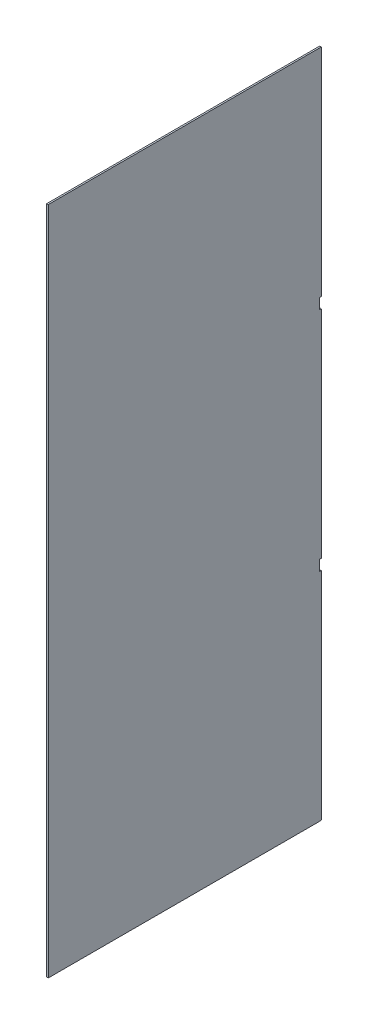
ISO-10303-21;
HEADER;
FILE_DESCRIPTION(('STEP AP214'),'2;1');
FILE_NAME('part.step','',(''),(''),'','','');
FILE_SCHEMA(('AUTOMOTIVE_DESIGN { 1 0 10303 214 1 1 1 1 }'));
ENDSEC;
DATA;
#1=APPLICATION_CONTEXT('core data for automotive mechanical design processes');
#2=APPLICATION_PROTOCOL_DEFINITION('international standard','automotive_design',2000,#1);
#3=PRODUCT_CONTEXT('',#1,'mechanical');
#4=PRODUCT('Part','Part','',(#3));
#5=PRODUCT_RELATED_PRODUCT_CATEGORY('part','',(#4));
#6=PRODUCT_DEFINITION_FORMATION('','',#4);
#7=PRODUCT_DEFINITION_CONTEXT('part definition',#1,'design');
#8=PRODUCT_DEFINITION('design','',#6,#7);
#9=PRODUCT_DEFINITION_SHAPE('','',#8);
#10=(LENGTH_UNIT() NAMED_UNIT(*) SI_UNIT(.MILLI.,.METRE.));
#11=(NAMED_UNIT(*) PLANE_ANGLE_UNIT() SI_UNIT($,.RADIAN.));
#12=(NAMED_UNIT(*) SI_UNIT($,.STERADIAN.) SOLID_ANGLE_UNIT());
#13=UNCERTAINTY_MEASURE_WITH_UNIT(LENGTH_MEASURE(1.E-05),#10,'distance_accuracy_value','');
#14=(GEOMETRIC_REPRESENTATION_CONTEXT(3) GLOBAL_UNCERTAINTY_ASSIGNED_CONTEXT((#13)) GLOBAL_UNIT_ASSIGNED_CONTEXT((#10,
#11,#12)) REPRESENTATION_CONTEXT('',''));
#15=CARTESIAN_POINT('',(0.,0.,0.));
#16=DIRECTION('',(0.,0.,1.));
#17=DIRECTION('',(1.,0.,0.));
#18=AXIS2_PLACEMENT_3D('',#15,#16,#17);
#19=CARTESIAN_POINT('',(1156.5,-317.646446609407,0.));
#20=DIRECTION('',(-1.,0.,0.));
#21=DIRECTION('',(0.,0.,1.));
#22=AXIS2_PLACEMENT_3D('',#19,#20,#21);
#23=PLANE('',#22);
#24=DIRECTION('',(0.,-1.,0.));
#25=VECTOR('',#24,1.);
#26=CARTESIAN_POINT('',(1156.5,-111.864297739604,0.1));
#27=LINE('',#26,#25);
#28=CARTESIAN_POINT('',(1156.5,-101.664297739604,0.1));
#29=VERTEX_POINT('',#28);
#30=CARTESIAN_POINT('',(1156.5,-111.864297739604,0.1));
#31=VERTEX_POINT('',#30);
#32=EDGE_CURVE('E266',#29,#31,#27,.T.);
#33=ORIENTED_EDGE('',*,*,#32,.T.);
#34=DIRECTION('',(0.,0.,-1.));
#35=VECTOR('',#34,1.);
#36=CARTESIAN_POINT('',(1156.5,-111.864297739604,0.1));
#37=LINE('',#36,#35);
#38=CARTESIAN_POINT('',(1156.5,-111.864297739604,-1.5));
#39=VERTEX_POINT('',#38);
#40=EDGE_CURVE('E184',#31,#39,#37,.T.);
#41=ORIENTED_EDGE('',*,*,#40,.T.);
#42=DIRECTION('',(0.,1.,0.));
#43=VECTOR('',#42,1.);
#44=CARTESIAN_POINT('',(1156.5,0.,-1.5));
#45=LINE('',#44,#43);
#46=CARTESIAN_POINT('',(1156.5,-317.570949809759,-1.50000000000002));
#47=VERTEX_POINT('',#46);
#48=EDGE_CURVE('E181',#47,#39,#45,.T.);
#49=ORIENTED_EDGE('',*,*,#48,.F.);
#50=CARTESIAN_POINT('',(1156.5,-317.792893218813,0.99999999999989));
#51=CARTESIAN_POINT('',(1156.5,-317.786609806184,0.966309690952009));
#52=CARTESIAN_POINT('',(1156.5,-317.780328859056,0.932618841833622));
#53=CARTESIAN_POINT('',(1156.5,-317.767887585589,0.865213200375286));
#54=CARTESIAN_POINT('',(1156.5,-317.761727265328,0.831498406917054));
#55=CARTESIAN_POINT('',(1156.5,-317.743599909906,0.730278600137569));
#56=CARTESIAN_POINT('',(1156.5,-317.731988467574,0.66270842432302));
#57=CARTESIAN_POINT('',(1156.5,-317.710315359939,0.527426946711467));
#58=CARTESIAN_POINT('',(1156.5,-317.700251270042,0.459716037732602));
#59=CARTESIAN_POINT('',(1156.5,-317.68178544429,0.324077550471007));
#60=CARTESIAN_POINT('',(1156.5,-317.673383491061,0.256150001702762));
#61=CARTESIAN_POINT('',(1156.5,-317.65526496963,0.0949400044562187));
#62=CARTESIAN_POINT('',(1156.5,-317.646213721255,0.00158314827205674));
#63=CARTESIAN_POINT('',(1156.5,-317.630310381769,-0.185338218842859));
#64=CARTESIAN_POINT('',(1156.5,-317.623458922619,-0.27890278168484));
#65=CARTESIAN_POINT('',(1156.5,-317.611351881694,-0.466161615554037));
#66=CARTESIAN_POINT('',(1156.5,-317.606096796812,-0.559855917866876));
#67=CARTESIAN_POINT('',(1156.5,-317.596722208589,-0.747625999299935));
#68=CARTESIAN_POINT('',(1156.5,-317.59260671305,-0.841701973049577));
#69=CARTESIAN_POINT('',(1156.5,-317.585215357846,-1.0298492465556));
#70=CARTESIAN_POINT('',(1156.5,-317.581939171368,-1.12392053382746));
#71=CARTESIAN_POINT('',(1156.5,-317.576021424713,-1.31199319030472));
#72=CARTESIAN_POINT('',(1156.5,-317.573379260256,-1.40599454027652));
#73=CARTESIAN_POINT('',(1156.5,-317.570949809759,-1.50000000000002));
#74=B_SPLINE_CURVE_WITH_KNOTS('',3,(#50,#51,#52,#53,#54,#55,#56,#57,#58,#59,#60,#61,#62,#63,#64,
#65,#66,#67,#68,#69,#70,#71,#72,#73),.UNSPECIFIED.,.F.,.F.,(4,2,2,2,2,2,2,2,2,2,2,4),(0.,
0.102813762637207,0.205632692706177,0.411301914964424,0.616645509351305,0.821962231041767,
1.10330892129798,1.38473636540587,1.6662513178507,1.94874410157372,2.23112671960106,
2.51323912285922),.UNSPECIFIED.);
#75=CARTESIAN_POINT('',(1156.5,-317.792893218813,0.99999999999989));
#76=VERTEX_POINT('',#75);
#77=EDGE_CURVE('E149',#76,#47,#74,.T.);
#78=ORIENTED_EDGE('',*,*,#77,.F.);
#79=DIRECTION('',(0.,0.,1.));
#80=VECTOR('',#79,1.);
#81=CARTESIAN_POINT('',(1156.5,-317.792893218813,-3.99680288865056E-12));
#82=LINE('',#81,#80);
#83=CARTESIAN_POINT('',(1156.5,-317.792893218813,258.5));
#84=VERTEX_POINT('',#83);
#85=EDGE_CURVE('E128',#76,#84,#82,.T.);
#86=ORIENTED_EDGE('',*,*,#85,.T.);
#87=DIRECTION('',(0.,1.,0.));
#88=VECTOR('',#87,1.);
#89=CARTESIAN_POINT('',(1156.5,0.,258.5));
#90=LINE('',#89,#88);
#91=CARTESIAN_POINT('',(1156.5,320.,258.5));
#92=VERTEX_POINT('',#91);
#93=EDGE_CURVE('E139',#84,#92,#90,.T.);
#94=ORIENTED_EDGE('',*,*,#93,.T.);
#95=DIRECTION('',(0.,0.,1.));
#96=VECTOR('',#95,1.);
#97=CARTESIAN_POINT('',(1156.5,320.,-1.5));
#98=LINE('',#97,#96);
#99=CARTESIAN_POINT('',(1156.5,320.,-1.5));
#100=VERTEX_POINT('',#99);
#101=EDGE_CURVE('E162',#100,#92,#98,.T.);
#102=ORIENTED_EDGE('',*,*,#101,.F.);
#103=DIRECTION('',(0.,1.,0.));
#104=VECTOR('',#103,1.);
#105=CARTESIAN_POINT('',(1156.5,0.,-1.5));
#106=LINE('',#105,#104);
#107=CARTESIAN_POINT('',(1156.5,114.217851130198,-1.5));
#108=VERTEX_POINT('',#107);
#109=EDGE_CURVE('E165',#108,#100,#106,.T.);
#110=ORIENTED_EDGE('',*,*,#109,.F.);
#111=DIRECTION('',(0.,0.,-1.));
#112=VECTOR('',#111,1.);
#113=CARTESIAN_POINT('',(1156.5,114.217851130198,0.1));
#114=LINE('',#113,#112);
#115=CARTESIAN_POINT('',(1156.5,114.217851130198,0.1));
#116=VERTEX_POINT('',#115);
#117=EDGE_CURVE('E56',#116,#108,#114,.T.);
#118=ORIENTED_EDGE('',*,*,#117,.F.);
#119=DIRECTION('',(0.,-1.,0.));
#120=VECTOR('',#119,1.);
#121=CARTESIAN_POINT('',(1156.5,104.017851130198,0.1));
#122=LINE('',#121,#120);
#123=CARTESIAN_POINT('',(1156.5,104.017851130198,0.1));
#124=VERTEX_POINT('',#123);
#125=EDGE_CURVE('E173',#116,#124,#122,.T.);
#126=ORIENTED_EDGE('',*,*,#125,.T.);
#127=DIRECTION('',(0.,0.,-1.));
#128=VECTOR('',#127,1.);
#129=CARTESIAN_POINT('',(1156.5,104.017851130198,0.1));
#130=LINE('',#129,#128);
#131=CARTESIAN_POINT('',(1156.5,104.017851130198,-1.5));
#132=VERTEX_POINT('',#131);
#133=EDGE_CURVE('E172',#124,#132,#130,.T.);
#134=ORIENTED_EDGE('',*,*,#133,.T.);
#135=DIRECTION('',(0.,1.,0.));
#136=VECTOR('',#135,1.);
#137=CARTESIAN_POINT('',(1156.5,0.,-1.5));
#138=LINE('',#137,#136);
#139=CARTESIAN_POINT('',(1156.5,-101.664297739604,-1.5));
#140=VERTEX_POINT('',#139);
#141=EDGE_CURVE('E168',#140,#132,#138,.T.);
#142=ORIENTED_EDGE('',*,*,#141,.F.);
#143=DIRECTION('',(0.,0.,-1.));
#144=VECTOR('',#143,1.);
#145=CARTESIAN_POINT('',(1156.5,-101.664297739604,0.1));
#146=LINE('',#145,#144);
#147=EDGE_CURVE('E182',#29,#140,#146,.T.);
#148=ORIENTED_EDGE('',*,*,#147,.F.);
#149=EDGE_LOOP('',(#33,#41,#49,#78,#86,#94,#102,#110,#118,#126,#134,#142,#148));
#150=FACE_BOUND('',#149,.T.);
#151=ADVANCED_FACE('F37',(#150),#23,.T.);
#152=CARTESIAN_POINT('',(1158.,0.,-3.99680288865056E-12));
#153=DIRECTION('',(-1.,0.,0.));
#154=DIRECTION('',(0.,0.,1.));
#155=AXIS2_PLACEMENT_3D('',#152,#153,#154);
#156=PLANE('',#155);
#157=DIRECTION('',(0.,0.,-1.));
#158=VECTOR('',#157,1.);
#159=CARTESIAN_POINT('',(1158.,-111.864297739604,0.1));
#160=LINE('',#159,#158);
#161=CARTESIAN_POINT('',(1158.,-111.864297739604,0.1));
#162=VERTEX_POINT('',#161);
#163=CARTESIAN_POINT('',(1158.,-111.864297739604,-1.5));
#164=VERTEX_POINT('',#163);
#165=EDGE_CURVE('E169',#162,#164,#160,.T.);
#166=ORIENTED_EDGE('',*,*,#165,.F.);
#167=DIRECTION('',(0.,1.,0.));
#168=VECTOR('',#167,1.);
#169=CARTESIAN_POINT('',(1158.,-111.864297739604,0.1));
#170=LINE('',#169,#168);
#171=CARTESIAN_POINT('',(1158.,-101.664297739604,0.1));
#172=VERTEX_POINT('',#171);
#173=EDGE_CURVE('E267',#162,#172,#170,.T.);
#174=ORIENTED_EDGE('',*,*,#173,.T.);
#175=DIRECTION('',(0.,0.,-1.));
#176=VECTOR('',#175,1.);
#177=CARTESIAN_POINT('',(1158.,-101.664297739604,0.1));
#178=LINE('',#177,#176);
#179=CARTESIAN_POINT('',(1158.,-101.664297739604,-1.5));
#180=VERTEX_POINT('',#179);
#181=EDGE_CURVE('E183',#172,#180,#178,.T.);
#182=ORIENTED_EDGE('',*,*,#181,.T.);
#183=DIRECTION('',(0.,-1.,0.));
#184=VECTOR('',#183,1.);
#185=CARTESIAN_POINT('',(1158.,0.,-1.5));
#186=LINE('',#185,#184);
#187=CARTESIAN_POINT('',(1158.,104.017851130198,-1.5));
#188=VERTEX_POINT('',#187);
#189=EDGE_CURVE('E188',#188,#180,#186,.T.);
#190=ORIENTED_EDGE('',*,*,#189,.F.);
#191=DIRECTION('',(0.,0.,-1.));
#192=VECTOR('',#191,1.);
#193=CARTESIAN_POINT('',(1158.,104.017851130198,0.1));
#194=LINE('',#193,#192);
#195=CARTESIAN_POINT('',(1158.,104.017851130198,0.1));
#196=VERTEX_POINT('',#195);
#197=EDGE_CURVE('E276',#196,#188,#194,.T.);
#198=ORIENTED_EDGE('',*,*,#197,.F.);
#199=DIRECTION('',(0.,1.,0.));
#200=VECTOR('',#199,1.);
#201=CARTESIAN_POINT('',(1158.,104.017851130198,0.1));
#202=LINE('',#201,#200);
#203=CARTESIAN_POINT('',(1158.,114.217851130198,0.1));
#204=VERTEX_POINT('',#203);
#205=EDGE_CURVE('E259',#196,#204,#202,.T.);
#206=ORIENTED_EDGE('',*,*,#205,.T.);
#207=DIRECTION('',(0.,0.,-1.));
#208=VECTOR('',#207,1.);
#209=CARTESIAN_POINT('',(1158.,114.217851130198,0.1));
#210=LINE('',#209,#208);
#211=CARTESIAN_POINT('',(1158.,114.217851130198,-1.5));
#212=VERTEX_POINT('',#211);
#213=EDGE_CURVE('E171',#204,#212,#210,.T.);
#214=ORIENTED_EDGE('',*,*,#213,.T.);
#215=DIRECTION('',(0.,-1.,0.));
#216=VECTOR('',#215,1.);
#217=CARTESIAN_POINT('',(1158.,0.,-1.5));
#218=LINE('',#217,#216);
#219=CARTESIAN_POINT('',(1158.,320.,-1.5));
#220=VERTEX_POINT('',#219);
#221=EDGE_CURVE('E281',#220,#212,#218,.T.);
#222=ORIENTED_EDGE('',*,*,#221,.F.);
#223=DIRECTION('',(0.,0.,1.));
#224=VECTOR('',#223,1.);
#225=CARTESIAN_POINT('',(1158.,320.,-1.5));
#226=LINE('',#225,#224);
#227=CARTESIAN_POINT('',(1158.,320.,258.5));
#228=VERTEX_POINT('',#227);
#229=EDGE_CURVE('E164',#228,#220,#226,.F.);
#230=ORIENTED_EDGE('',*,*,#229,.F.);
#231=DIRECTION('',(0.,1.,0.));
#232=VECTOR('',#231,1.);
#233=CARTESIAN_POINT('',(1158.,0.,258.5));
#234=LINE('',#233,#232);
#235=CARTESIAN_POINT('',(1158.,-317.792893218813,258.5));
#236=VERTEX_POINT('',#235);
#237=EDGE_CURVE('E151',#236,#228,#234,.T.);
#238=ORIENTED_EDGE('',*,*,#237,.F.);
#239=DIRECTION('',(0.,0.,1.));
#240=VECTOR('',#239,1.);
#241=CARTESIAN_POINT('',(1158.,-317.792893218813,-3.99680288865056E-12));
#242=LINE('',#241,#240);
#243=CARTESIAN_POINT('',(1158.,-317.792893218813,0.99999999999989));
#244=VERTEX_POINT('',#243);
#245=EDGE_CURVE('E131',#244,#236,#242,.T.);
#246=ORIENTED_EDGE('',*,*,#245,.F.);
#247=CARTESIAN_POINT('',(1158.,-317.792893218813,0.99999999999989));
#248=CARTESIAN_POINT('',(1158.,-317.785943147787,0.906879053127047));
#249=CARTESIAN_POINT('',(1158.,-317.779000897427,0.813757266004337));
#250=CARTESIAN_POINT('',(1158.,-317.765283064933,0.627500401941172));
#251=CARTESIAN_POINT('',(1158.,-317.758507484687,0.534365324862199));
#252=CARTESIAN_POINT('',(1158.,-317.74527436914,0.348074992535708));
#253=CARTESIAN_POINT('',(1158.,-317.738816824922,0.254919737927536));
#254=CARTESIAN_POINT('',(1158.,-317.726322502331,0.0685814119255063));
#255=CARTESIAN_POINT('',(1158.,-317.72028572212,-0.0246016593450436));
#256=CARTESIAN_POINT('',(1157.99999999999,-317.702910269873,-0.304208268926558));
#257=CARTESIAN_POINT('',(1157.99999999999,-317.692307281587,-0.490678264821633));
#258=CARTESIAN_POINT('',(1158.00000000001,-317.673113556665,-0.863724268077645));
#259=CARTESIAN_POINT('',(1158.00000000003,-317.664522855774,-1.05030027726266));
#260=CARTESIAN_POINT('',(1158.00000000003,-317.649061574956,-1.42353070574692));
#261=CARTESIAN_POINT('',(1158.00000000001,-317.642191070501,-1.61018512812668));
#262=CARTESIAN_POINT('',(1157.99999999999,-317.629822854174,-1.98354131924659));
#263=CARTESIAN_POINT('',(1158.,-317.624325161995,-2.17024308862746));
#264=CARTESIAN_POINT('',(1158.,-317.614387642955,-2.54367121993566));
#265=CARTESIAN_POINT('',(1158.,-317.609947799591,-2.73039758143391));
#266=CARTESIAN_POINT('',(1158.,-317.601892033191,-3.10386196895722));
#267=CARTESIAN_POINT('',(1158.,-317.598276082464,-3.2905999943792));
#268=CARTESIAN_POINT('',(1158.,-317.594955023375,-3.47734220892314));
#269=B_SPLINE_CURVE_WITH_KNOTS('',3,(#247,#248,#249,#250,#251,#252,#253,#254,#255,#256,#257,
#258,#259,#260,#261,#262,#263,#264,#265,#266,#267,#268),.UNSPECIFIED.,.F.,.F.,(4,2,2,2,2,2,2,2,
2,2,4),(0.,0.280140261512677,0.560283694471325,0.840419268634549,1.12055361889824,
1.68085521906906,2.2411667709462,2.80150290138244,3.36184706899121,3.92218249501902,
4.48249908576639),.UNSPECIFIED.);
#270=CARTESIAN_POINT('',(1158.,-317.646446609407,-1.5));
#271=VERTEX_POINT('',#270);
#272=EDGE_CURVE('E198',#244,#271,#269,.T.);
#273=ORIENTED_EDGE('',*,*,#272,.T.);
#274=DIRECTION('',(0.,-1.,0.));
#275=VECTOR('',#274,1.);
#276=CARTESIAN_POINT('',(1158.,0.,-1.5));
#277=LINE('',#276,#275);
#278=EDGE_CURVE('E186',#164,#271,#277,.T.);
#279=ORIENTED_EDGE('',*,*,#278,.F.);
#280=EDGE_LOOP('',(#166,#174,#182,#190,#198,#206,#214,#222,#230,#238,#246,#273,#279));
#281=FACE_BOUND('',#280,.T.);
#282=ADVANCED_FACE('F39',(#281),#156,.F.);
#283=CARTESIAN_POINT('',(-2.,0.,-1.5));
#284=DIRECTION('',(0.,0.,-1.));
#285=DIRECTION('',(-1.,0.,0.));
#286=AXIS2_PLACEMENT_3D('',#283,#284,#285);
#287=PLANE('',#286);
#288=ORIENTED_EDGE('',*,*,#48,.T.);
#289=DIRECTION('',(1.,0.,0.));
#290=VECTOR('',#289,1.);
#291=CARTESIAN_POINT('',(-2.,-111.864297739604,-1.5));
#292=LINE('',#291,#290);
#293=EDGE_CURVE('E11',#39,#164,#292,.T.);
#294=ORIENTED_EDGE('',*,*,#293,.T.);
#295=ORIENTED_EDGE('',*,*,#278,.T.);
#296=CARTESIAN_POINT('',(1157.99999999999,-317.646446609407,-1.49999999999999));
#297=CARTESIAN_POINT('',(1157.8133594813,-317.639520415266,-1.5));
#298=CARTESIAN_POINT('',(1157.6267471672,-317.631756261718,-1.5));
#299=CARTESIAN_POINT('',(1157.25361644994,-317.614364590249,-1.5));
#300=CARTESIAN_POINT('',(1157.06709804363,-317.60473713955,-1.5));
#301=CARTESIAN_POINT('',(1156.78741194537,-317.588757676065,-1.5));
#302=CARTESIAN_POINT('',(1156.69420002348,-317.583174911015,-1.5));
#303=CARTESIAN_POINT('',(1156.50780581991,-317.571529796677,-1.5));
#304=CARTESIAN_POINT('',(1156.41462353834,-317.565467445633,-1.5));
#305=CARTESIAN_POINT('',(1156.22827829022,-317.552922484048,-1.5));
#306=CARTESIAN_POINT('',(1156.13511532645,-317.546439832356,-1.5));
#307=CARTESIAN_POINT('',(1155.94881147071,-317.533172326635,-1.5));
#308=CARTESIAN_POINT('',(1155.8556705786,-317.526387474589,-1.5));
#309=CARTESIAN_POINT('',(1155.76253691875,-317.519510240886,-1.5));
#310=B_SPLINE_CURVE_WITH_KNOTS('',3,(#296,#297,#298,#299,#300,#301,#302,#303,#304,#305,#306,
#307,#308,#309),.UNSPECIFIED.,.F.,.F.,(4,2,2,2,2,2,4),(0.,0.560309821182127,1.12059943183715,
1.40073506244348,1.680871719103,1.96103584468831,2.2411981315468),.UNSPECIFIED.);
#311=EDGE_CURVE('E190',#47,#271,#310,.F.);
#312=ORIENTED_EDGE('',*,*,#311,.F.);
#313=EDGE_LOOP('',(#288,#294,#295,#312));
#314=FACE_BOUND('',#313,.T.);
#315=ADVANCED_FACE('F204',(#314),#287,.T.);
#316=ORIENTED_EDGE('',*,*,#189,.T.);
#317=DIRECTION('',(-1.,0.,0.));
#318=VECTOR('',#317,1.);
#319=CARTESIAN_POINT('',(-2.,-101.664297739604,-1.5));
#320=LINE('',#319,#318);
#321=EDGE_CURVE('E47',#180,#140,#320,.T.);
#322=ORIENTED_EDGE('',*,*,#321,.T.);
#323=ORIENTED_EDGE('',*,*,#141,.T.);
#324=DIRECTION('',(1.,0.,0.));
#325=VECTOR('',#324,1.);
#326=CARTESIAN_POINT('',(-2.,104.017851130198,-1.5));
#327=LINE('',#326,#325);
#328=EDGE_CURVE('E252',#132,#188,#327,.T.);
#329=ORIENTED_EDGE('',*,*,#328,.T.);
#330=EDGE_LOOP('',(#316,#322,#323,#329));
#331=FACE_BOUND('',#330,.T.);
#332=ADVANCED_FACE('F208',(#331),#287,.T.);
#333=ORIENTED_EDGE('',*,*,#221,.T.);
#334=DIRECTION('',(-1.,0.,0.));
#335=VECTOR('',#334,1.);
#336=CARTESIAN_POINT('',(-2.,114.217851130198,-1.5));
#337=LINE('',#336,#335);
#338=EDGE_CURVE('E255',#212,#108,#337,.T.);
#339=ORIENTED_EDGE('',*,*,#338,.T.);
#340=ORIENTED_EDGE('',*,*,#109,.T.);
#341=DIRECTION('',(-1.,0.,0.));
#342=VECTOR('',#341,1.);
#343=CARTESIAN_POINT('',(-2.,320.,-1.5));
#344=LINE('',#343,#342);
#345=EDGE_CURVE('E189',#100,#220,#344,.F.);
#346=ORIENTED_EDGE('',*,*,#345,.T.);
#347=EDGE_LOOP('',(#333,#339,#340,#346));
#348=FACE_BOUND('',#347,.T.);
#349=ADVANCED_FACE('F210',(#348),#287,.T.);
#350=CARTESIAN_POINT('',(1156.5,-317.792893218813,0.));
#351=DIRECTION('',(0.,-1.,0.));
#352=DIRECTION('',(0.,0.,-1.));
#353=AXIS2_PLACEMENT_3D('',#350,#351,#352);
#354=PLANE('',#353);
#355=ORIENTED_EDGE('',*,*,#245,.T.);
#356=DIRECTION('',(-1.,0.,0.));
#357=VECTOR('',#356,1.);
#358=CARTESIAN_POINT('',(1158.,-317.792893218813,258.5));
#359=LINE('',#358,#357);
#360=EDGE_CURVE('E123',#236,#84,#359,.T.);
#361=ORIENTED_EDGE('',*,*,#360,.T.);
#362=ORIENTED_EDGE('',*,*,#85,.F.);
#363=DIRECTION('',(1.,0.,0.));
#364=VECTOR('',#363,1.);
#365=CARTESIAN_POINT('',(1156.5,-317.792893218813,0.99999999999989));
#366=LINE('',#365,#364);
#367=EDGE_CURVE('E135',#76,#244,#366,.T.);
#368=ORIENTED_EDGE('',*,*,#367,.T.);
#369=EDGE_LOOP('',(#355,#361,#362,#368));
#370=FACE_BOUND('',#369,.T.);
#371=ADVANCED_FACE('F125',(#370),#354,.T.);
#372=CARTESIAN_POINT('',(1158.,-320.,258.5));
#373=DIRECTION('',(0.,0.,-1.));
#374=DIRECTION('',(-1.,0.,0.));
#375=AXIS2_PLACEMENT_3D('',#372,#373,#374);
#376=PLANE('',#375);
#377=DIRECTION('',(-1.,0.,0.));
#378=VECTOR('',#377,1.);
#379=CARTESIAN_POINT('',(1158.,320.,258.5));
#380=LINE('',#379,#378);
#381=EDGE_CURVE('E136',#92,#228,#380,.F.);
#382=ORIENTED_EDGE('',*,*,#381,.F.);
#383=ORIENTED_EDGE('',*,*,#93,.F.);
#384=ORIENTED_EDGE('',*,*,#360,.F.);
#385=ORIENTED_EDGE('',*,*,#237,.T.);
#386=EDGE_LOOP('',(#382,#383,#384,#385));
#387=FACE_BOUND('',#386,.T.);
#388=ADVANCED_FACE('F140',(#387),#376,.F.);
#389=CARTESIAN_POINT('',(-1162.,320.,-1.5));
#390=DIRECTION('',(0.,1.,0.));
#391=DIRECTION('',(0.,0.,1.));
#392=AXIS2_PLACEMENT_3D('',#389,#390,#391);
#393=PLANE('',#392);
#394=ORIENTED_EDGE('',*,*,#345,.F.);
#395=ORIENTED_EDGE('',*,*,#101,.T.);
#396=ORIENTED_EDGE('',*,*,#381,.T.);
#397=ORIENTED_EDGE('',*,*,#229,.T.);
#398=EDGE_LOOP('',(#394,#395,#396,#397));
#399=FACE_BOUND('',#398,.T.);
#400=ADVANCED_FACE('F215',(#399),#393,.T.);
#401=CARTESIAN_POINT('',(1155.5,-317.5,-2.55074710937637));
#402=CARTESIAN_POINT('',(1155.96487551084,-317.524412231068,-2.55074710937637));
#403=CARTESIAN_POINT('',(1156.42940054378,-317.548815536469,-2.45833066629151));
#404=CARTESIAN_POINT('',(1157.28822363878,-317.597631072938,-2.10259449266165));
#405=CARTESIAN_POINT('',(1157.68209998953,-317.622038841172,-1.83941472910936));
#406=CARTESIAN_POINT('',(1158.33941472909,-317.670854377641,-1.18209998952684));
#407=CARTESIAN_POINT('',(1158.60259449266,-317.695262145876,-0.788223638779089));
#408=CARTESIAN_POINT('',(1158.9583306663,-317.744077682345,0.0705994562253489));
#409=CARTESIAN_POINT('',(1159.05074710938,-317.768480987746,0.535124489155971));
#410=CARTESIAN_POINT('',(1159.05074710938,-317.792893218813,0.99999999999989));
#411=CARTESIAN_POINT('',(1155.5,-317.5,-1.51499999999999));
#412=CARTESIAN_POINT('',(1155.82927176458,-317.524412145779,-1.51499999999999));
#413=CARTESIAN_POINT('',(1156.15829592916,-317.548815536469,-1.44954128182082));
#414=CARTESIAN_POINT('',(1156.76660173563,-317.597631072938,-1.19757276671098));
#415=CARTESIAN_POINT('',(1157.04558500074,-317.622038841172,-1.01116210863136));
#416=CARTESIAN_POINT('',(1157.51116210863,-317.670854377641,-0.54558500073687));
#417=CARTESIAN_POINT('',(1157.69757276671,-317.695262145876,-0.26660173563281));
#418=CARTESIAN_POINT('',(1157.94954128182,-317.744077682345,0.341704070836363));
#419=CARTESIAN_POINT('',(1158.015,-317.768481073034,0.670728235423329));
#420=CARTESIAN_POINT('',(1158.015,-317.792893218813,0.99999999999989));
#421=CARTESIAN_POINT('',(1155.5,-317.5,-1.5));
#422=CARTESIAN_POINT('',(1155.82730791049,-317.524412144544,-1.5));
#423=CARTESIAN_POINT('',(1156.1543697109,-317.548815536469,-1.4349316916708));
#424=CARTESIAN_POINT('',(1156.75904745093,-317.597631072938,-1.18446597088567));
#425=CARTESIAN_POINT('',(1157.03636679994,-317.622038841172,-0.999167105995402));
#426=CARTESIAN_POINT('',(1157.499167106,-317.670854377641,-0.536366799937266));
#427=CARTESIAN_POINT('',(1157.68446597089,-317.695262145876,-0.259047450927252));
#428=CARTESIAN_POINT('',(1157.93493169167,-317.744077682345,0.345630289101756));
#429=CARTESIAN_POINT('',(1158.,-317.76848107427,0.672692089510485));
#430=CARTESIAN_POINT('',(1158.,-317.792893218813,0.99999999999989));
#431=CARTESIAN_POINT('',(1155.5,-317.5,0.));
#432=CARTESIAN_POINT('',(1155.63092250178,-317.524412021028,0.));
#433=CARTESIAN_POINT('',(1155.76174788436,-317.548815536469,0.0260273233316788));
#434=CARTESIAN_POINT('',(1156.00361898037,-317.597631072938,0.12621361164572));
#435=CARTESIAN_POINT('',(1156.11454671998,-317.622038841172,0.20033315760179));
#436=CARTESIAN_POINT('',(1156.2996668424,-317.670854377641,0.385453280025039));
#437=CARTESIAN_POINT('',(1156.37378638835,-317.695262145876,0.496381019629039));
#438=CARTESIAN_POINT('',(1156.47397267667,-317.744077682345,0.738252115640631));
#439=CARTESIAN_POINT('',(1156.5,-317.768481197786,0.86907749822468));
#440=CARTESIAN_POINT('',(1156.5,-317.792893218813,0.99999999999989));
#441=CARTESIAN_POINT('',(1155.5,-317.5,0.0151499999999916));
#442=CARTESIAN_POINT('',(1155.62893900915,-317.52441201978,0.0151499999999916));
#443=CARTESIAN_POINT('',(1155.75778240391,-317.548815536469,0.0407830093832051));
#444=CARTESIAN_POINT('',(1155.99598915282,-317.597631072938,0.139451475429292));
#445=CARTESIAN_POINT('',(1156.10523633717,-317.622038841172,0.212448110264135));
#446=CARTESIAN_POINT('',(1156.28755188974,-317.670854377641,0.39476366283267));
#447=CARTESIAN_POINT('',(1156.36054852457,-317.695262145876,0.504010847181657));
#448=CARTESIAN_POINT('',(1156.45921699062,-317.744077682345,0.742217596088696));
#449=CARTESIAN_POINT('',(1156.48485,-317.768481199033,0.871060990852685));
#450=CARTESIAN_POINT('',(1156.48485,-317.792893218813,0.99999999999989));
#451=CARTESIAN_POINT('',(1155.5,-317.5,0.707106781182877));
#452=CARTESIAN_POINT('',(1155.53834553229,-317.524411962805,0.707106781182877));
#453=CARTESIAN_POINT('',(1155.57666418035,-317.548815536469,0.714730007691129));
#454=CARTESIAN_POINT('',(1155.64750658422,-317.597631072938,0.744073892156875));
#455=CARTESIAN_POINT('',(1155.67999656693,-317.622038841172,0.765783004549563));
#456=CARTESIAN_POINT('',(1155.73421699545,-317.670854377641,0.820003433073767));
#457=CARTESIAN_POINT('',(1155.75592610784,-317.695262145876,0.852493415781889));
#458=CARTESIAN_POINT('',(1155.78526999231,-317.744077682345,0.923335819632469));
#459=CARTESIAN_POINT('',(1155.79289321881,-317.768481256011,0.961654467709121));
#460=CARTESIAN_POINT('',(1155.79289321881,-317.792893218813,0.99999999999989));
#461=B_SPLINE_SURFACE_WITH_KNOTS('',1,3,((#401,#402,#403,#404,#405,#406,#407,#408,#409,#410),
(#411,#412,#413,#414,#415,#416,#417,#418,#419,#420),(#421,#422,#423,#424,#425,#426,#427,#428,
#429,#430),(#431,#432,#433,#434,#435,#436,#437,#438,#439,#440),(#441,#442,#443,#444,#445,#446,
#447,#448,#449,#450),(#451,#452,#453,#454,#455,#456,#457,#458,#459,#460)),.UNSPECIFIED.,.F.,.F.,
.F.,(2,1,1,1,1,2),(4,2,2,2,4),(-0.700498072918176,-0.01,0.,1.,1.0101,1.47140452078885),(0.,0.25,
0.5,0.75,1.),.UNSPECIFIED.);
#462=ORIENTED_EDGE('',*,*,#77,.T.);
#463=ORIENTED_EDGE('',*,*,#311,.T.);
#464=ORIENTED_EDGE('',*,*,#272,.F.);
#465=ORIENTED_EDGE('',*,*,#367,.F.);
#466=EDGE_LOOP('',(#462,#463,#464,#465));
#467=FACE_BOUND('',#466,.T.);
#468=ADVANCED_FACE('F200',(#467),#461,.F.);
#469=CARTESIAN_POINT('',(1156.5,104.017851130198,0.1));
#470=DIRECTION('',(0.,1.,0.));
#471=DIRECTION('',(0.,0.,1.));
#472=AXIS2_PLACEMENT_3D('',#469,#470,#471);
#473=PLANE('',#472);
#474=ORIENTED_EDGE('',*,*,#133,.F.);
#475=DIRECTION('',(1.,0.,0.));
#476=VECTOR('',#475,1.);
#477=CARTESIAN_POINT('',(1156.5,104.017851130198,0.1));
#478=LINE('',#477,#476);
#479=EDGE_CURVE('E256',#124,#196,#478,.T.);
#480=ORIENTED_EDGE('',*,*,#479,.T.);
#481=ORIENTED_EDGE('',*,*,#197,.T.);
#482=ORIENTED_EDGE('',*,*,#328,.F.);
#483=EDGE_LOOP('',(#474,#480,#481,#482));
#484=FACE_BOUND('',#483,.T.);
#485=ADVANCED_FACE('F219',(#484),#473,.T.);
#486=CARTESIAN_POINT('',(1156.5,114.217851130198,0.1));
#487=DIRECTION('',(0.,-1.,0.));
#488=DIRECTION('',(0.,0.,-1.));
#489=AXIS2_PLACEMENT_3D('',#486,#487,#488);
#490=PLANE('',#489);
#491=ORIENTED_EDGE('',*,*,#213,.F.);
#492=DIRECTION('',(-1.,0.,0.));
#493=VECTOR('',#492,1.);
#494=CARTESIAN_POINT('',(1156.5,114.217851130198,0.1));
#495=LINE('',#494,#493);
#496=EDGE_CURVE('E176',#204,#116,#495,.T.);
#497=ORIENTED_EDGE('',*,*,#496,.T.);
#498=ORIENTED_EDGE('',*,*,#117,.T.);
#499=ORIENTED_EDGE('',*,*,#338,.F.);
#500=EDGE_LOOP('',(#491,#497,#498,#499));
#501=FACE_BOUND('',#500,.T.);
#502=ADVANCED_FACE('F222',(#501),#490,.T.);
#503=CARTESIAN_POINT('',(-2.,0.,0.1));
#504=DIRECTION('',(0.,0.,1.));
#505=DIRECTION('',(1.,0.,0.));
#506=AXIS2_PLACEMENT_3D('',#503,#504,#505);
#507=PLANE('',#506);
#508=ORIENTED_EDGE('',*,*,#479,.F.);
#509=ORIENTED_EDGE('',*,*,#125,.F.);
#510=ORIENTED_EDGE('',*,*,#496,.F.);
#511=ORIENTED_EDGE('',*,*,#205,.F.);
#512=EDGE_LOOP('',(#508,#509,#510,#511));
#513=FACE_BOUND('',#512,.T.);
#514=ADVANCED_FACE('F226',(#513),#507,.F.);
#515=CARTESIAN_POINT('',(1156.5,-111.864297739604,0.1));
#516=DIRECTION('',(0.,1.,0.));
#517=DIRECTION('',(0.,0.,1.));
#518=AXIS2_PLACEMENT_3D('',#515,#516,#517);
#519=PLANE('',#518);
#520=ORIENTED_EDGE('',*,*,#40,.F.);
#521=DIRECTION('',(1.,0.,0.));
#522=VECTOR('',#521,1.);
#523=CARTESIAN_POINT('',(1156.5,-111.864297739604,0.1));
#524=LINE('',#523,#522);
#525=EDGE_CURVE('E41',#31,#162,#524,.T.);
#526=ORIENTED_EDGE('',*,*,#525,.T.);
#527=ORIENTED_EDGE('',*,*,#165,.T.);
#528=ORIENTED_EDGE('',*,*,#293,.F.);
#529=EDGE_LOOP('',(#520,#526,#527,#528));
#530=FACE_BOUND('',#529,.T.);
#531=ADVANCED_FACE('F229',(#530),#519,.T.);
#532=CARTESIAN_POINT('',(1156.5,-101.664297739604,0.1));
#533=DIRECTION('',(0.,-1.,0.));
#534=DIRECTION('',(0.,0.,-1.));
#535=AXIS2_PLACEMENT_3D('',#532,#533,#534);
#536=PLANE('',#535);
#537=ORIENTED_EDGE('',*,*,#181,.F.);
#538=DIRECTION('',(-1.,0.,0.));
#539=VECTOR('',#538,1.);
#540=CARTESIAN_POINT('',(1156.5,-101.664297739604,0.1));
#541=LINE('',#540,#539);
#542=EDGE_CURVE('E264',#172,#29,#541,.T.);
#543=ORIENTED_EDGE('',*,*,#542,.T.);
#544=ORIENTED_EDGE('',*,*,#147,.T.);
#545=ORIENTED_EDGE('',*,*,#321,.F.);
#546=EDGE_LOOP('',(#537,#543,#544,#545));
#547=FACE_BOUND('',#546,.T.);
#548=ADVANCED_FACE('F233',(#547),#536,.T.);
#549=CARTESIAN_POINT('',(-2.,0.,0.1));
#550=DIRECTION('',(0.,0.,1.));
#551=DIRECTION('',(1.,0.,0.));
#552=AXIS2_PLACEMENT_3D('',#549,#550,#551);
#553=PLANE('',#552);
#554=ORIENTED_EDGE('',*,*,#525,.F.);
#555=ORIENTED_EDGE('',*,*,#32,.F.);
#556=ORIENTED_EDGE('',*,*,#542,.F.);
#557=ORIENTED_EDGE('',*,*,#173,.F.);
#558=EDGE_LOOP('',(#554,#555,#556,#557));
#559=FACE_BOUND('',#558,.T.);
#560=ADVANCED_FACE('F237',(#559),#553,.F.);
#561=CLOSED_SHELL('',(#151,#282,#315,#332,#349,#371,#388,#400,#468,#485,#502,#514,#531,#548,#560));
#562=MANIFOLD_SOLID_BREP('B2',#561);
#563=ADVANCED_BREP_SHAPE_REPRESENTATION('',(#18,#562),#14);
#564=SHAPE_DEFINITION_REPRESENTATION(#9,#563);
ENDSEC;
END-ISO-10303-21;
